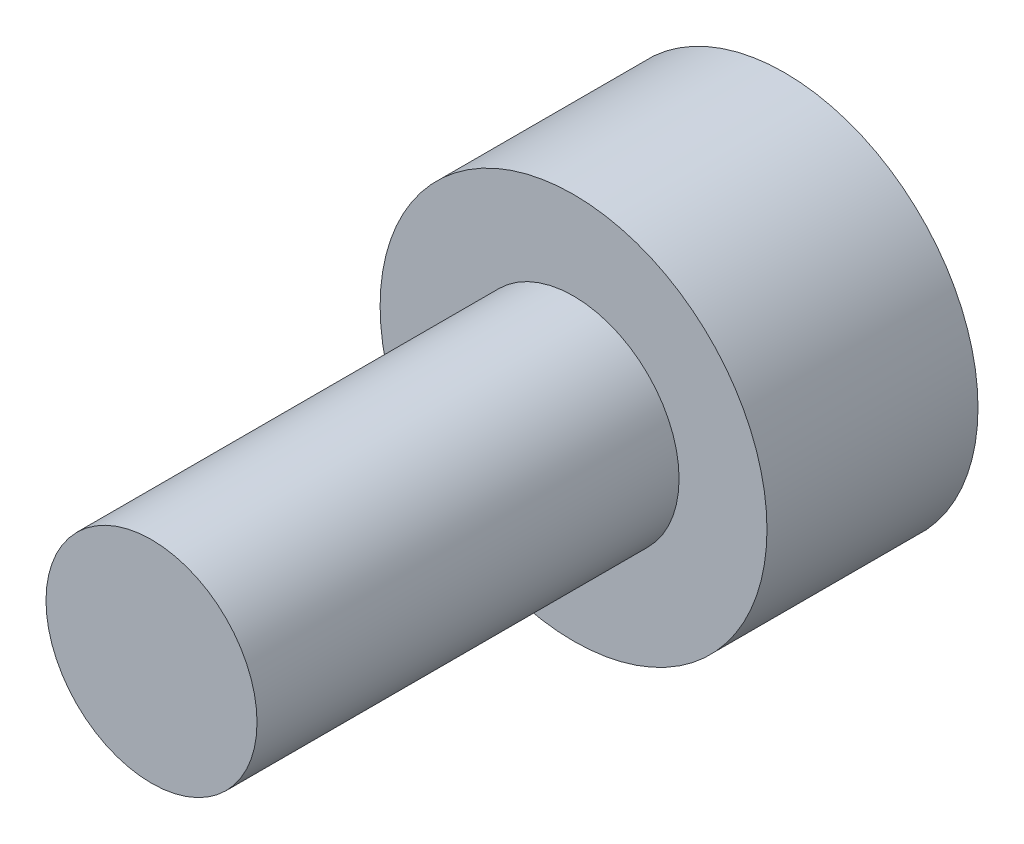
ISO-10303-21;
HEADER;
FILE_DESCRIPTION(('STEP AP214'),'2;1');
FILE_NAME('part.step','',(''),(''),'','','');
FILE_SCHEMA(('AUTOMOTIVE_DESIGN { 1 0 10303 214 1 1 1 1 }'));
ENDSEC;
DATA;
#1=APPLICATION_CONTEXT('core data for automotive mechanical design processes');
#2=APPLICATION_PROTOCOL_DEFINITION('international standard','automotive_design',2000,#1);
#3=PRODUCT_CONTEXT('',#1,'mechanical');
#4=PRODUCT('Part','Part','',(#3));
#5=PRODUCT_RELATED_PRODUCT_CATEGORY('part','',(#4));
#6=PRODUCT_DEFINITION_FORMATION('','',#4);
#7=PRODUCT_DEFINITION_CONTEXT('part definition',#1,'design');
#8=PRODUCT_DEFINITION('design','',#6,#7);
#9=PRODUCT_DEFINITION_SHAPE('','',#8);
#10=(LENGTH_UNIT() NAMED_UNIT(*) SI_UNIT(.MILLI.,.METRE.));
#11=(NAMED_UNIT(*) PLANE_ANGLE_UNIT() SI_UNIT($,.RADIAN.));
#12=(NAMED_UNIT(*) SI_UNIT($,.STERADIAN.) SOLID_ANGLE_UNIT());
#13=UNCERTAINTY_MEASURE_WITH_UNIT(LENGTH_MEASURE(1.E-05),#10,'distance_accuracy_value','');
#14=(GEOMETRIC_REPRESENTATION_CONTEXT(3) GLOBAL_UNCERTAINTY_ASSIGNED_CONTEXT((#13)) GLOBAL_UNIT_ASSIGNED_CONTEXT((#10,
#11,#12)) REPRESENTATION_CONTEXT('',''));
#15=CARTESIAN_POINT('',(0.,0.,0.));
#16=DIRECTION('',(0.,0.,1.));
#17=DIRECTION('',(1.,0.,0.));
#18=AXIS2_PLACEMENT_3D('',#15,#16,#17);
#19=CARTESIAN_POINT('',(0.,0.,-6.));
#20=DIRECTION('',(0.,0.,1.));
#21=DIRECTION('',(1.,0.,0.));
#22=AXIS2_PLACEMENT_3D('',#19,#20,#21);
#23=CYLINDRICAL_SURFACE('',#22,1.5);
#24=CARTESIAN_POINT('',(0.,0.,-6.));
#25=DIRECTION('',(0.,0.,-1.));
#26=DIRECTION('',(-1.,0.,0.));
#27=AXIS2_PLACEMENT_3D('',#24,#25,#26);
#28=CIRCLE('',#27,1.5);
#29=CARTESIAN_POINT('',(-1.5,0.,-6.));
#30=VERTEX_POINT('',#29);
#31=EDGE_CURVE('E40',#30,#30,#28,.F.);
#32=ORIENTED_EDGE('',*,*,#31,.T.);
#33=EDGE_LOOP('',(#32));
#34=FACE_BOUND('',#33,.T.);
#35=CARTESIAN_POINT('',(0.,0.,0.));
#36=DIRECTION('',(0.,0.,1.));
#37=DIRECTION('',(1.,0.,0.));
#38=AXIS2_PLACEMENT_3D('',#35,#36,#37);
#39=CIRCLE('',#38,1.5);
#40=CARTESIAN_POINT('',(1.5,0.,0.));
#41=VERTEX_POINT('',#40);
#42=EDGE_CURVE('E11',#41,#41,#39,.T.);
#43=ORIENTED_EDGE('',*,*,#42,.F.);
#44=EDGE_LOOP('',(#43));
#45=FACE_BOUND('',#44,.T.);
#46=ADVANCED_FACE('F33',(#34,#45),#23,.T.);
#47=CARTESIAN_POINT('',(0.,0.,0.));
#48=DIRECTION('',(0.,0.,1.));
#49=DIRECTION('',(1.,0.,0.));
#50=AXIS2_PLACEMENT_3D('',#47,#48,#49);
#51=PLANE('',#50);
#52=ORIENTED_EDGE('',*,*,#42,.T.);
#53=EDGE_LOOP('',(#52));
#54=FACE_BOUND('',#53,.T.);
#55=ADVANCED_FACE('F159',(#54),#51,.T.);
#56=CARTESIAN_POINT('',(0.,0.,-9.));
#57=DIRECTION('',(0.,0.,1.));
#58=DIRECTION('',(1.,0.,0.));
#59=AXIS2_PLACEMENT_3D('',#56,#57,#58);
#60=CYLINDRICAL_SURFACE('',#59,2.75);
#61=CARTESIAN_POINT('',(0.,0.,-9.));
#62=DIRECTION('',(0.,0.,-1.));
#63=DIRECTION('',(-1.,0.,0.));
#64=AXIS2_PLACEMENT_3D('',#61,#62,#63);
#65=CIRCLE('',#64,2.75);
#66=CARTESIAN_POINT('',(-2.75,0.,-9.));
#67=VERTEX_POINT('',#66);
#68=EDGE_CURVE('E140',#67,#67,#65,.T.);
#69=ORIENTED_EDGE('',*,*,#68,.F.);
#70=EDGE_LOOP('',(#69));
#71=FACE_BOUND('',#70,.T.);
#72=CARTESIAN_POINT('',(0.,0.,-6.));
#73=DIRECTION('',(0.,0.,-1.));
#74=DIRECTION('',(-1.,0.,0.));
#75=AXIS2_PLACEMENT_3D('',#72,#73,#74);
#76=CIRCLE('',#75,2.75);
#77=CARTESIAN_POINT('',(-2.75,0.,-6.));
#78=VERTEX_POINT('',#77);
#79=EDGE_CURVE('E134',#78,#78,#76,.T.);
#80=ORIENTED_EDGE('',*,*,#79,.T.);
#81=EDGE_LOOP('',(#80));
#82=FACE_BOUND('',#81,.T.);
#83=ADVANCED_FACE('F157',(#71,#82),#60,.T.);
#84=CARTESIAN_POINT('',(0.,0.,-9.));
#85=DIRECTION('',(0.,0.,-1.));
#86=DIRECTION('',(-1.,0.,0.));
#87=AXIS2_PLACEMENT_3D('',#84,#85,#86);
#88=PLANE('',#87);
#89=DIRECTION('',(0.866025403784439,0.5,0.));
#90=VECTOR('',#89,1.);
#91=CARTESIAN_POINT('',(-1.25,0.721687836487032,-9.));
#92=LINE('',#91,#90);
#93=CARTESIAN_POINT('',(-1.25,0.721687836487032,-9.));
#94=VERTEX_POINT('',#93);
#95=CARTESIAN_POINT('',(0.,1.44337567297406,-9.));
#96=VERTEX_POINT('',#95);
#97=EDGE_CURVE('E47',#94,#96,#92,.T.);
#98=ORIENTED_EDGE('',*,*,#97,.F.);
#99=DIRECTION('',(0.,1.,0.));
#100=VECTOR('',#99,1.);
#101=CARTESIAN_POINT('',(-1.25,-0.721687836487032,-9.));
#102=LINE('',#101,#100);
#103=CARTESIAN_POINT('',(-1.25,-0.721687836487032,-9.));
#104=VERTEX_POINT('',#103);
#105=EDGE_CURVE('E130',#104,#94,#102,.T.);
#106=ORIENTED_EDGE('',*,*,#105,.F.);
#107=DIRECTION('',(-0.866025403784439,0.5,0.));
#108=VECTOR('',#107,1.);
#109=CARTESIAN_POINT('',(0.,-1.44337567297406,-9.));
#110=LINE('',#109,#108);
#111=CARTESIAN_POINT('',(0.,-1.44337567297406,-9.));
#112=VERTEX_POINT('',#111);
#113=EDGE_CURVE('E128',#112,#104,#110,.T.);
#114=ORIENTED_EDGE('',*,*,#113,.F.);
#115=DIRECTION('',(-0.866025403784439,-0.5,0.));
#116=VECTOR('',#115,1.);
#117=CARTESIAN_POINT('',(1.25,-0.721687836487033,-9.));
#118=LINE('',#117,#116);
#119=CARTESIAN_POINT('',(1.25,-0.721687836487033,-9.));
#120=VERTEX_POINT('',#119);
#121=EDGE_CURVE('E95',#120,#112,#118,.T.);
#122=ORIENTED_EDGE('',*,*,#121,.F.);
#123=DIRECTION('',(0.,-1.,0.));
#124=VECTOR('',#123,1.);
#125=CARTESIAN_POINT('',(1.25,0.721687836487032,-9.));
#126=LINE('',#125,#124);
#127=CARTESIAN_POINT('',(1.25,0.721687836487032,-9.));
#128=VERTEX_POINT('',#127);
#129=EDGE_CURVE('E124',#128,#120,#126,.T.);
#130=ORIENTED_EDGE('',*,*,#129,.F.);
#131=DIRECTION('',(0.866025403784439,-0.5,0.));
#132=VECTOR('',#131,1.);
#133=CARTESIAN_POINT('',(0.,1.44337567297406,-9.));
#134=LINE('',#133,#132);
#135=EDGE_CURVE('E121',#96,#128,#134,.T.);
#136=ORIENTED_EDGE('',*,*,#135,.F.);
#137=EDGE_LOOP('',(#98,#106,#114,#122,#130,#136));
#138=FACE_BOUND('',#137,.T.);
#139=ORIENTED_EDGE('',*,*,#68,.T.);
#140=EDGE_LOOP('',(#139));
#141=FACE_BOUND('',#140,.T.);
#142=ADVANCED_FACE('F153',(#138,#141),#88,.T.);
#143=CARTESIAN_POINT('',(0.,0.,-6.));
#144=DIRECTION('',(0.,0.,-1.));
#145=DIRECTION('',(-1.,0.,0.));
#146=AXIS2_PLACEMENT_3D('',#143,#144,#145);
#147=PLANE('',#146);
#148=ORIENTED_EDGE('',*,*,#31,.F.);
#149=EDGE_LOOP('',(#148));
#150=FACE_BOUND('',#149,.T.);
#151=ORIENTED_EDGE('',*,*,#79,.F.);
#152=EDGE_LOOP('',(#151));
#153=FACE_BOUND('',#152,.T.);
#154=ADVANCED_FACE('F149',(#150,#153),#147,.F.);
#155=CARTESIAN_POINT('',(-1.25,0.721687836487032,-7.125));
#156=DIRECTION('',(-0.5,0.866025403784439,0.));
#157=DIRECTION('',(-0.866025403784439,-0.5,0.));
#158=AXIS2_PLACEMENT_3D('',#155,#156,#157);
#159=PLANE('',#158);
#160=ORIENTED_EDGE('',*,*,#97,.T.);
#161=DIRECTION('',(0.,0.,-1.));
#162=VECTOR('',#161,1.);
#163=CARTESIAN_POINT('',(0.,1.44337567297406,-7.125));
#164=LINE('',#163,#162);
#165=CARTESIAN_POINT('',(0.,1.44337567297406,-7.125));
#166=VERTEX_POINT('',#165);
#167=EDGE_CURVE('E77',#166,#96,#164,.T.);
#168=ORIENTED_EDGE('',*,*,#167,.F.);
#169=DIRECTION('',(0.866025403784439,0.5,0.));
#170=VECTOR('',#169,1.);
#171=CARTESIAN_POINT('',(-1.25,0.721687836487032,-7.125));
#172=LINE('',#171,#170);
#173=CARTESIAN_POINT('',(-1.25,0.721687836487032,-7.125));
#174=VERTEX_POINT('',#173);
#175=EDGE_CURVE('E132',#174,#166,#172,.T.);
#176=ORIENTED_EDGE('',*,*,#175,.F.);
#177=DIRECTION('',(0.,0.,-1.));
#178=VECTOR('',#177,1.);
#179=CARTESIAN_POINT('',(-1.25,0.721687836487032,-7.125));
#180=LINE('',#179,#178);
#181=EDGE_CURVE('E55',#174,#94,#180,.T.);
#182=ORIENTED_EDGE('',*,*,#181,.T.);
#183=EDGE_LOOP('',(#160,#168,#176,#182));
#184=FACE_BOUND('',#183,.T.);
#185=ADVANCED_FACE('F152',(#184),#159,.F.);
#186=CARTESIAN_POINT('',(-1.25,-0.721687836487032,-7.125));
#187=DIRECTION('',(-1.,0.,0.));
#188=DIRECTION('',(0.,-1.,0.));
#189=AXIS2_PLACEMENT_3D('',#186,#187,#188);
#190=PLANE('',#189);
#191=ORIENTED_EDGE('',*,*,#105,.T.);
#192=ORIENTED_EDGE('',*,*,#181,.F.);
#193=DIRECTION('',(0.,1.,0.));
#194=VECTOR('',#193,1.);
#195=CARTESIAN_POINT('',(-1.25,-0.721687836487032,-7.125));
#196=LINE('',#195,#194);
#197=CARTESIAN_POINT('',(-1.25,-0.721687836487032,-7.125));
#198=VERTEX_POINT('',#197);
#199=EDGE_CURVE('E107',#198,#174,#196,.T.);
#200=ORIENTED_EDGE('',*,*,#199,.F.);
#201=DIRECTION('',(0.,0.,-1.));
#202=VECTOR('',#201,1.);
#203=CARTESIAN_POINT('',(-1.25,-0.721687836487032,-7.125));
#204=LINE('',#203,#202);
#205=EDGE_CURVE('E99',#198,#104,#204,.T.);
#206=ORIENTED_EDGE('',*,*,#205,.T.);
#207=EDGE_LOOP('',(#191,#192,#200,#206));
#208=FACE_BOUND('',#207,.T.);
#209=ADVANCED_FACE('F202',(#208),#190,.F.);
#210=CARTESIAN_POINT('',(0.,-1.44337567297406,-7.125));
#211=DIRECTION('',(-0.5,-0.866025403784439,0.));
#212=DIRECTION('',(0.866025403784439,-0.5,0.));
#213=AXIS2_PLACEMENT_3D('',#210,#211,#212);
#214=PLANE('',#213);
#215=ORIENTED_EDGE('',*,*,#113,.T.);
#216=ORIENTED_EDGE('',*,*,#205,.F.);
#217=DIRECTION('',(-0.866025403784439,0.5,0.));
#218=VECTOR('',#217,1.);
#219=CARTESIAN_POINT('',(0.,-1.44337567297406,-7.125));
#220=LINE('',#219,#218);
#221=CARTESIAN_POINT('',(0.,-1.44337567297406,-7.125));
#222=VERTEX_POINT('',#221);
#223=EDGE_CURVE('E103',#222,#198,#220,.T.);
#224=ORIENTED_EDGE('',*,*,#223,.F.);
#225=DIRECTION('',(0.,0.,-1.));
#226=VECTOR('',#225,1.);
#227=CARTESIAN_POINT('',(0.,-1.44337567297406,-7.125));
#228=LINE('',#227,#226);
#229=EDGE_CURVE('E88',#222,#112,#228,.T.);
#230=ORIENTED_EDGE('',*,*,#229,.T.);
#231=EDGE_LOOP('',(#215,#216,#224,#230));
#232=FACE_BOUND('',#231,.T.);
#233=ADVANCED_FACE('F104',(#232),#214,.F.);
#234=CARTESIAN_POINT('',(1.25,-0.721687836487033,-7.125));
#235=DIRECTION('',(0.5,-0.866025403784439,0.));
#236=DIRECTION('',(0.866025403784439,0.5,0.));
#237=AXIS2_PLACEMENT_3D('',#234,#235,#236);
#238=PLANE('',#237);
#239=ORIENTED_EDGE('',*,*,#121,.T.);
#240=ORIENTED_EDGE('',*,*,#229,.F.);
#241=DIRECTION('',(-0.866025403784439,-0.5,0.));
#242=VECTOR('',#241,1.);
#243=CARTESIAN_POINT('',(1.25,-0.721687836487033,-7.125));
#244=LINE('',#243,#242);
#245=CARTESIAN_POINT('',(1.25,-0.721687836487033,-7.125));
#246=VERTEX_POINT('',#245);
#247=EDGE_CURVE('E92',#246,#222,#244,.T.);
#248=ORIENTED_EDGE('',*,*,#247,.F.);
#249=DIRECTION('',(0.,0.,-1.));
#250=VECTOR('',#249,1.);
#251=CARTESIAN_POINT('',(1.25,-0.721687836487033,-7.125));
#252=LINE('',#251,#250);
#253=EDGE_CURVE('E100',#246,#120,#252,.T.);
#254=ORIENTED_EDGE('',*,*,#253,.T.);
#255=EDGE_LOOP('',(#239,#240,#248,#254));
#256=FACE_BOUND('',#255,.T.);
#257=ADVANCED_FACE('F90',(#256),#238,.F.);
#258=CARTESIAN_POINT('',(1.25,0.721687836487032,-7.125));
#259=DIRECTION('',(1.,0.,0.));
#260=DIRECTION('',(0.,0.,-1.));
#261=AXIS2_PLACEMENT_3D('',#258,#259,#260);
#262=PLANE('',#261);
#263=ORIENTED_EDGE('',*,*,#129,.T.);
#264=ORIENTED_EDGE('',*,*,#253,.F.);
#265=DIRECTION('',(0.,-1.,0.));
#266=VECTOR('',#265,1.);
#267=CARTESIAN_POINT('',(1.25,0.721687836487032,-7.125));
#268=LINE('',#267,#266);
#269=CARTESIAN_POINT('',(1.25,0.721687836487032,-7.125));
#270=VERTEX_POINT('',#269);
#271=EDGE_CURVE('E113',#270,#246,#268,.T.);
#272=ORIENTED_EDGE('',*,*,#271,.F.);
#273=DIRECTION('',(0.,0.,-1.));
#274=VECTOR('',#273,1.);
#275=CARTESIAN_POINT('',(1.25,0.721687836487032,-7.125));
#276=LINE('',#275,#274);
#277=EDGE_CURVE('E137',#270,#128,#276,.T.);
#278=ORIENTED_EDGE('',*,*,#277,.T.);
#279=EDGE_LOOP('',(#263,#264,#272,#278));
#280=FACE_BOUND('',#279,.T.);
#281=ADVANCED_FACE('F227',(#280),#262,.F.);
#282=CARTESIAN_POINT('',(0.,1.44337567297406,-7.125));
#283=DIRECTION('',(0.5,0.866025403784439,0.));
#284=DIRECTION('',(-0.866025403784439,0.5,0.));
#285=AXIS2_PLACEMENT_3D('',#282,#283,#284);
#286=PLANE('',#285);
#287=ORIENTED_EDGE('',*,*,#135,.T.);
#288=ORIENTED_EDGE('',*,*,#277,.F.);
#289=DIRECTION('',(0.866025403784439,-0.5,0.));
#290=VECTOR('',#289,1.);
#291=CARTESIAN_POINT('',(0.,1.44337567297406,-7.125));
#292=LINE('',#291,#290);
#293=EDGE_CURVE('E115',#166,#270,#292,.T.);
#294=ORIENTED_EDGE('',*,*,#293,.F.);
#295=ORIENTED_EDGE('',*,*,#167,.T.);
#296=EDGE_LOOP('',(#287,#288,#294,#295));
#297=FACE_BOUND('',#296,.T.);
#298=ADVANCED_FACE('F236',(#297),#286,.F.);
#299=CARTESIAN_POINT('',(1.25,2.1650635094611,-7.125));
#300=DIRECTION('',(0.,0.,-1.));
#301=DIRECTION('',(-1.,0.,0.));
#302=AXIS2_PLACEMENT_3D('',#299,#300,#301);
#303=PLANE('',#302);
#304=ORIENTED_EDGE('',*,*,#175,.T.);
#305=ORIENTED_EDGE('',*,*,#293,.T.);
#306=ORIENTED_EDGE('',*,*,#271,.T.);
#307=ORIENTED_EDGE('',*,*,#247,.T.);
#308=ORIENTED_EDGE('',*,*,#223,.T.);
#309=ORIENTED_EDGE('',*,*,#199,.T.);
#310=EDGE_LOOP('',(#304,#305,#306,#307,#308,#309));
#311=FACE_BOUND('',#310,.T.);
#312=ADVANCED_FACE('F110',(#311),#303,.T.);
#313=CLOSED_SHELL('',(#46,#55,#83,#142,#154,#185,#209,#233,#257,#281,#298,#312));
#314=MANIFOLD_SOLID_BREP('B2',#313);
#315=ADVANCED_BREP_SHAPE_REPRESENTATION('',(#18,#314),#14);
#316=SHAPE_DEFINITION_REPRESENTATION(#9,#315);
ENDSEC;
END-ISO-10303-21;
